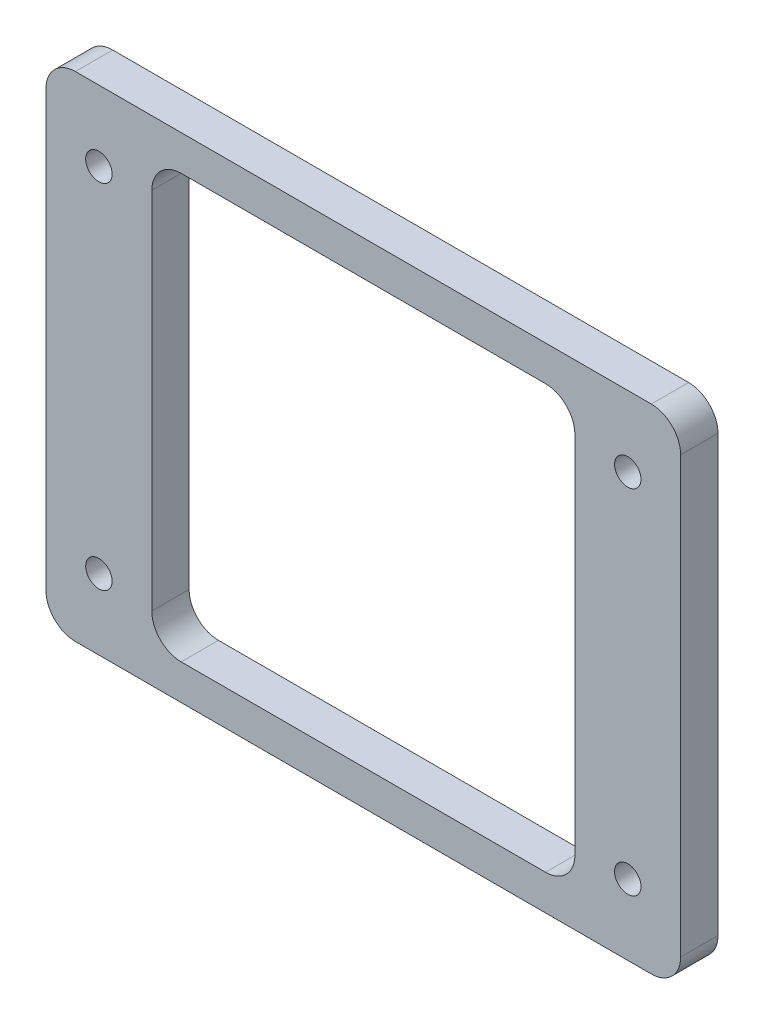
ISO-10303-21;
HEADER;
FILE_DESCRIPTION(('STEP AP214'),'2;1');
FILE_NAME('part.step','',(''),(''),'','','');
FILE_SCHEMA(('AUTOMOTIVE_DESIGN { 1 0 10303 214 1 1 1 1 }'));
ENDSEC;
DATA;
#1=APPLICATION_CONTEXT('core data for automotive mechanical design processes');
#2=APPLICATION_PROTOCOL_DEFINITION('international standard','automotive_design',2000,#1);
#3=PRODUCT_CONTEXT('',#1,'mechanical');
#4=PRODUCT('Part','Part','',(#3));
#5=PRODUCT_RELATED_PRODUCT_CATEGORY('part','',(#4));
#6=PRODUCT_DEFINITION_FORMATION('','',#4);
#7=PRODUCT_DEFINITION_CONTEXT('part definition',#1,'design');
#8=PRODUCT_DEFINITION('design','',#6,#7);
#9=PRODUCT_DEFINITION_SHAPE('','',#8);
#10=(LENGTH_UNIT() NAMED_UNIT(*) SI_UNIT(.MILLI.,.METRE.));
#11=(NAMED_UNIT(*) PLANE_ANGLE_UNIT() SI_UNIT($,.RADIAN.));
#12=(NAMED_UNIT(*) SI_UNIT($,.STERADIAN.) SOLID_ANGLE_UNIT());
#13=UNCERTAINTY_MEASURE_WITH_UNIT(LENGTH_MEASURE(1.E-05),#10,'distance_accuracy_value','');
#14=(GEOMETRIC_REPRESENTATION_CONTEXT(3) GLOBAL_UNCERTAINTY_ASSIGNED_CONTEXT((#13)) GLOBAL_UNIT_ASSIGNED_CONTEXT((#10,
#11,#12)) REPRESENTATION_CONTEXT('',''));
#15=CARTESIAN_POINT('',(0.,0.,0.));
#16=DIRECTION('',(0.,0.,1.));
#17=DIRECTION('',(1.,0.,0.));
#18=AXIS2_PLACEMENT_3D('',#15,#16,#17);
#19=CARTESIAN_POINT('',(0.,0.,6.35));
#20=DIRECTION('',(0.,0.,1.));
#21=DIRECTION('',(1.,0.,0.));
#22=AXIS2_PLACEMENT_3D('',#19,#20,#21);
#23=PLANE('',#22);
#24=CARTESIAN_POINT('',(45.1075947427528,-30.,6.35));
#25=DIRECTION('',(0.,0.,1.));
#26=DIRECTION('',(1.,0.,0.));
#27=AXIS2_PLACEMENT_3D('',#24,#25,#26);
#28=CIRCLE('',#27,2.25);
#29=CARTESIAN_POINT('',(47.3575947427528,-30.,6.35));
#30=VERTEX_POINT('',#29);
#31=EDGE_CURVE('E284',#30,#30,#28,.T.);
#32=ORIENTED_EDGE('',*,*,#31,.F.);
#33=EDGE_LOOP('',(#32));
#34=FACE_BOUND('',#33,.T.);
#35=CARTESIAN_POINT('',(-44.8924052572479,30.,6.35));
#36=DIRECTION('',(0.,0.,1.));
#37=DIRECTION('',(1.,0.,0.));
#38=AXIS2_PLACEMENT_3D('',#35,#36,#37);
#39=CIRCLE('',#38,2.25);
#40=CARTESIAN_POINT('',(-42.6424052572479,30.,6.35));
#41=VERTEX_POINT('',#40);
#42=EDGE_CURVE('E296',#41,#41,#39,.T.);
#43=ORIENTED_EDGE('',*,*,#42,.F.);
#44=EDGE_LOOP('',(#43));
#45=FACE_BOUND('',#44,.T.);
#46=DIRECTION('',(1.,0.,0.));
#47=VECTOR('',#46,1.);
#48=CARTESIAN_POINT('',(54.1075947427522,-42.,6.35));
#49=LINE('',#48,#47);
#50=CARTESIAN_POINT('',(-48.8924052572479,-42.,6.35));
#51=VERTEX_POINT('',#50);
#52=CARTESIAN_POINT('',(49.1075947427522,-42.,6.35));
#53=VERTEX_POINT('',#52);
#54=EDGE_CURVE('E303',#51,#53,#49,.T.);
#55=ORIENTED_EDGE('',*,*,#54,.T.);
#56=CARTESIAN_POINT('',(49.1075947427522,-37.,6.35));
#57=DIRECTION('',(0.,0.,1.));
#58=DIRECTION('',(1.,0.,0.));
#59=AXIS2_PLACEMENT_3D('',#56,#57,#58);
#60=CIRCLE('',#59,5.);
#61=CARTESIAN_POINT('',(54.1075947427522,-37.,6.35));
#62=VERTEX_POINT('',#61);
#63=EDGE_CURVE('E202',#53,#62,#60,.T.);
#64=ORIENTED_EDGE('',*,*,#63,.T.);
#65=DIRECTION('',(0.,1.,0.));
#66=VECTOR('',#65,1.);
#67=CARTESIAN_POINT('',(54.1075947427522,-42.,6.35));
#68=LINE('',#67,#66);
#69=CARTESIAN_POINT('',(54.1075947427522,37.,6.35));
#70=VERTEX_POINT('',#69);
#71=EDGE_CURVE('E170',#62,#70,#68,.T.);
#72=ORIENTED_EDGE('',*,*,#71,.T.);
#73=CARTESIAN_POINT('',(49.1075947427522,37.,6.35));
#74=DIRECTION('',(0.,0.,1.));
#75=DIRECTION('',(1.,0.,0.));
#76=AXIS2_PLACEMENT_3D('',#73,#74,#75);
#77=CIRCLE('',#76,5.);
#78=CARTESIAN_POINT('',(49.1075947427522,42.,6.35));
#79=VERTEX_POINT('',#78);
#80=EDGE_CURVE('E200',#70,#79,#77,.T.);
#81=ORIENTED_EDGE('',*,*,#80,.T.);
#82=DIRECTION('',(-1.,0.,0.));
#83=VECTOR('',#82,1.);
#84=CARTESIAN_POINT('',(54.1075947427522,42.,6.35));
#85=LINE('',#84,#83);
#86=CARTESIAN_POINT('',(-48.8924052572479,42.,6.35));
#87=VERTEX_POINT('',#86);
#88=EDGE_CURVE('E187',#79,#87,#85,.T.);
#89=ORIENTED_EDGE('',*,*,#88,.T.);
#90=CARTESIAN_POINT('',(-48.8924052572478,37.,6.35));
#91=DIRECTION('',(0.,0.,1.));
#92=DIRECTION('',(1.,0.,0.));
#93=AXIS2_PLACEMENT_3D('',#90,#91,#92);
#94=CIRCLE('',#93,5.);
#95=CARTESIAN_POINT('',(-53.8924052572478,37.,6.35));
#96=VERTEX_POINT('',#95);
#97=EDGE_CURVE('E196',#87,#96,#94,.T.);
#98=ORIENTED_EDGE('',*,*,#97,.T.);
#99=DIRECTION('',(0.,-1.,0.));
#100=VECTOR('',#99,1.);
#101=CARTESIAN_POINT('',(-53.8924052572478,-42.,6.35));
#102=LINE('',#101,#100);
#103=CARTESIAN_POINT('',(-53.8924052572478,-37.,6.35));
#104=VERTEX_POINT('',#103);
#105=EDGE_CURVE('E181',#96,#104,#102,.T.);
#106=ORIENTED_EDGE('',*,*,#105,.T.);
#107=CARTESIAN_POINT('',(-48.8924052572479,-37.,6.35));
#108=DIRECTION('',(0.,0.,1.));
#109=DIRECTION('',(1.,0.,0.));
#110=AXIS2_PLACEMENT_3D('',#107,#108,#109);
#111=CIRCLE('',#110,5.);
#112=EDGE_CURVE('E198',#104,#51,#111,.T.);
#113=ORIENTED_EDGE('',*,*,#112,.T.);
#114=EDGE_LOOP('',(#55,#64,#72,#81,#89,#98,#106,#113));
#115=FACE_BOUND('',#114,.T.);
#116=CARTESIAN_POINT('',(45.1075947427521,30.,6.35));
#117=DIRECTION('',(0.,0.,1.));
#118=DIRECTION('',(1.,0.,0.));
#119=AXIS2_PLACEMENT_3D('',#116,#117,#118);
#120=CIRCLE('',#119,2.25);
#121=CARTESIAN_POINT('',(47.3575947427521,30.,6.35));
#122=VERTEX_POINT('',#121);
#123=EDGE_CURVE('E290',#122,#122,#120,.T.);
#124=ORIENTED_EDGE('',*,*,#123,.F.);
#125=EDGE_LOOP('',(#124));
#126=FACE_BOUND('',#125,.T.);
#127=CARTESIAN_POINT('',(-44.8924052572472,-30.,6.35));
#128=DIRECTION('',(0.,0.,1.));
#129=DIRECTION('',(1.,0.,0.));
#130=AXIS2_PLACEMENT_3D('',#127,#128,#129);
#131=CIRCLE('',#130,2.25);
#132=CARTESIAN_POINT('',(-42.6424052572472,-30.,6.35));
#133=VERTEX_POINT('',#132);
#134=EDGE_CURVE('E278',#133,#133,#131,.T.);
#135=ORIENTED_EDGE('',*,*,#134,.F.);
#136=EDGE_LOOP('',(#135));
#137=FACE_BOUND('',#136,.T.);
#138=DIRECTION('',(1.,0.,0.));
#139=VECTOR('',#138,1.);
#140=CARTESIAN_POINT('',(36.1075947427521,-36.,6.35));
#141=LINE('',#140,#139);
#142=CARTESIAN_POINT('',(-30.8924052572478,-36.,6.35));
#143=VERTEX_POINT('',#142);
#144=CARTESIAN_POINT('',(31.1075947427521,-36.,6.35));
#145=VERTEX_POINT('',#144);
#146=EDGE_CURVE('E263',#143,#145,#141,.T.);
#147=ORIENTED_EDGE('',*,*,#146,.F.);
#148=CARTESIAN_POINT('',(-30.8924052572478,-31.,6.35));
#149=DIRECTION('',(0.,0.,1.));
#150=DIRECTION('',(1.,0.,0.));
#151=AXIS2_PLACEMENT_3D('',#148,#149,#150);
#152=CIRCLE('',#151,5.);
#153=CARTESIAN_POINT('',(-35.8924052572479,-31.,6.35));
#154=VERTEX_POINT('',#153);
#155=EDGE_CURVE('E239',#143,#154,#152,.F.);
#156=ORIENTED_EDGE('',*,*,#155,.T.);
#157=DIRECTION('',(0.,-1.,0.));
#158=VECTOR('',#157,1.);
#159=CARTESIAN_POINT('',(-35.8924052572479,-36.,6.35));
#160=LINE('',#159,#158);
#161=CARTESIAN_POINT('',(-35.8924052572479,31.,6.35));
#162=VERTEX_POINT('',#161);
#163=EDGE_CURVE('E256',#162,#154,#160,.T.);
#164=ORIENTED_EDGE('',*,*,#163,.F.);
#165=CARTESIAN_POINT('',(-30.8924052572478,31.,6.35));
#166=DIRECTION('',(0.,0.,1.));
#167=DIRECTION('',(1.,0.,0.));
#168=AXIS2_PLACEMENT_3D('',#165,#166,#167);
#169=CIRCLE('',#168,5.);
#170=CARTESIAN_POINT('',(-30.8924052572478,36.,6.35));
#171=VERTEX_POINT('',#170);
#172=EDGE_CURVE('E243',#162,#171,#169,.F.);
#173=ORIENTED_EDGE('',*,*,#172,.T.);
#174=DIRECTION('',(-1.,0.,0.));
#175=VECTOR('',#174,1.);
#176=CARTESIAN_POINT('',(36.1075947427521,36.,6.35));
#177=LINE('',#176,#175);
#178=CARTESIAN_POINT('',(31.1075947427521,36.,6.35));
#179=VERTEX_POINT('',#178);
#180=EDGE_CURVE('E262',#179,#171,#177,.T.);
#181=ORIENTED_EDGE('',*,*,#180,.F.);
#182=CARTESIAN_POINT('',(31.1075947427521,31.,6.35));
#183=DIRECTION('',(0.,0.,1.));
#184=DIRECTION('',(1.,0.,0.));
#185=AXIS2_PLACEMENT_3D('',#182,#183,#184);
#186=CIRCLE('',#185,5.);
#187=CARTESIAN_POINT('',(36.1075947427521,31.,6.35));
#188=VERTEX_POINT('',#187);
#189=EDGE_CURVE('E11',#179,#188,#186,.F.);
#190=ORIENTED_EDGE('',*,*,#189,.T.);
#191=DIRECTION('',(0.,1.,0.));
#192=VECTOR('',#191,1.);
#193=CARTESIAN_POINT('',(36.1075947427521,-36.,6.35));
#194=LINE('',#193,#192);
#195=CARTESIAN_POINT('',(36.1075947427521,-31.,6.35));
#196=VERTEX_POINT('',#195);
#197=EDGE_CURVE('E260',#196,#188,#194,.T.);
#198=ORIENTED_EDGE('',*,*,#197,.F.);
#199=CARTESIAN_POINT('',(31.1075947427521,-31.,6.35));
#200=DIRECTION('',(0.,0.,1.));
#201=DIRECTION('',(1.,0.,0.));
#202=AXIS2_PLACEMENT_3D('',#199,#200,#201);
#203=CIRCLE('',#202,5.);
#204=EDGE_CURVE('E235',#196,#145,#203,.F.);
#205=ORIENTED_EDGE('',*,*,#204,.T.);
#206=EDGE_LOOP('',(#147,#156,#164,#173,#181,#190,#198,#205));
#207=FACE_BOUND('',#206,.T.);
#208=ADVANCED_FACE('F37',(#34,#45,#115,#126,#137,#207),#23,.T.);
#209=CARTESIAN_POINT('',(0.,0.,0.));
#210=DIRECTION('',(0.,0.,1.));
#211=DIRECTION('',(1.,0.,0.));
#212=AXIS2_PLACEMENT_3D('',#209,#210,#211);
#213=PLANE('',#212);
#214=CARTESIAN_POINT('',(-44.8924052572472,-30.,0.));
#215=DIRECTION('',(0.,0.,1.));
#216=DIRECTION('',(1.,0.,0.));
#217=AXIS2_PLACEMENT_3D('',#214,#215,#216);
#218=CIRCLE('',#217,2.25);
#219=CARTESIAN_POINT('',(-42.6424052572472,-30.,0.));
#220=VERTEX_POINT('',#219);
#221=EDGE_CURVE('E265',#220,#220,#218,.T.);
#222=ORIENTED_EDGE('',*,*,#221,.T.);
#223=EDGE_LOOP('',(#222));
#224=FACE_BOUND('',#223,.T.);
#225=CARTESIAN_POINT('',(45.1075947427528,-30.,0.));
#226=DIRECTION('',(0.,0.,1.));
#227=DIRECTION('',(1.,0.,0.));
#228=AXIS2_PLACEMENT_3D('',#225,#226,#227);
#229=CIRCLE('',#228,2.25);
#230=CARTESIAN_POINT('',(47.3575947427528,-30.,0.));
#231=VERTEX_POINT('',#230);
#232=EDGE_CURVE('E281',#231,#231,#229,.T.);
#233=ORIENTED_EDGE('',*,*,#232,.T.);
#234=EDGE_LOOP('',(#233));
#235=FACE_BOUND('',#234,.T.);
#236=CARTESIAN_POINT('',(45.1075947427521,30.,0.));
#237=DIRECTION('',(0.,0.,1.));
#238=DIRECTION('',(1.,0.,0.));
#239=AXIS2_PLACEMENT_3D('',#236,#237,#238);
#240=CIRCLE('',#239,2.25);
#241=CARTESIAN_POINT('',(47.3575947427521,30.,0.));
#242=VERTEX_POINT('',#241);
#243=EDGE_CURVE('E287',#242,#242,#240,.T.);
#244=ORIENTED_EDGE('',*,*,#243,.T.);
#245=EDGE_LOOP('',(#244));
#246=FACE_BOUND('',#245,.T.);
#247=CARTESIAN_POINT('',(-44.8924052572479,30.,0.));
#248=DIRECTION('',(0.,0.,1.));
#249=DIRECTION('',(1.,0.,0.));
#250=AXIS2_PLACEMENT_3D('',#247,#248,#249);
#251=CIRCLE('',#250,2.25);
#252=CARTESIAN_POINT('',(-42.6424052572479,30.,0.));
#253=VERTEX_POINT('',#252);
#254=EDGE_CURVE('E293',#253,#253,#251,.T.);
#255=ORIENTED_EDGE('',*,*,#254,.T.);
#256=EDGE_LOOP('',(#255));
#257=FACE_BOUND('',#256,.T.);
#258=DIRECTION('',(0.,1.,0.));
#259=VECTOR('',#258,1.);
#260=CARTESIAN_POINT('',(54.1075947427522,-42.,0.));
#261=LINE('',#260,#259);
#262=CARTESIAN_POINT('',(54.1075947427522,-37.,0.));
#263=VERTEX_POINT('',#262);
#264=CARTESIAN_POINT('',(54.1075947427522,37.,0.));
#265=VERTEX_POINT('',#264);
#266=EDGE_CURVE('E167',#263,#265,#261,.T.);
#267=ORIENTED_EDGE('',*,*,#266,.F.);
#268=CARTESIAN_POINT('',(49.1075947427522,-37.,0.));
#269=DIRECTION('',(0.,0.,1.));
#270=DIRECTION('',(1.,0.,0.));
#271=AXIS2_PLACEMENT_3D('',#268,#269,#270);
#272=CIRCLE('',#271,5.);
#273=CARTESIAN_POINT('',(49.1075947427522,-42.,0.));
#274=VERTEX_POINT('',#273);
#275=EDGE_CURVE('E150',#263,#274,#272,.F.);
#276=ORIENTED_EDGE('',*,*,#275,.T.);
#277=DIRECTION('',(1.,0.,0.));
#278=VECTOR('',#277,1.);
#279=CARTESIAN_POINT('',(54.1075947427522,-42.,0.));
#280=LINE('',#279,#278);
#281=CARTESIAN_POINT('',(-48.8924052572479,-42.,0.));
#282=VERTEX_POINT('',#281);
#283=EDGE_CURVE('E178',#282,#274,#280,.T.);
#284=ORIENTED_EDGE('',*,*,#283,.F.);
#285=CARTESIAN_POINT('',(-48.8924052572479,-37.,0.));
#286=DIRECTION('',(0.,0.,1.));
#287=DIRECTION('',(1.,0.,0.));
#288=AXIS2_PLACEMENT_3D('',#285,#286,#287);
#289=CIRCLE('',#288,5.);
#290=CARTESIAN_POINT('',(-53.8924052572478,-37.,0.));
#291=VERTEX_POINT('',#290);
#292=EDGE_CURVE('E190',#282,#291,#289,.F.);
#293=ORIENTED_EDGE('',*,*,#292,.T.);
#294=DIRECTION('',(0.,-1.,0.));
#295=VECTOR('',#294,1.);
#296=CARTESIAN_POINT('',(-53.8924052572478,-42.,0.));
#297=LINE('',#296,#295);
#298=CARTESIAN_POINT('',(-53.8924052572478,37.,0.));
#299=VERTEX_POINT('',#298);
#300=EDGE_CURVE('E183',#299,#291,#297,.T.);
#301=ORIENTED_EDGE('',*,*,#300,.F.);
#302=CARTESIAN_POINT('',(-48.8924052572478,37.,0.));
#303=DIRECTION('',(0.,0.,1.));
#304=DIRECTION('',(1.,0.,0.));
#305=AXIS2_PLACEMENT_3D('',#302,#303,#304);
#306=CIRCLE('',#305,5.);
#307=CARTESIAN_POINT('',(-48.8924052572479,42.,0.));
#308=VERTEX_POINT('',#307);
#309=EDGE_CURVE('E171',#299,#308,#306,.F.);
#310=ORIENTED_EDGE('',*,*,#309,.T.);
#311=DIRECTION('',(-1.,0.,0.));
#312=VECTOR('',#311,1.);
#313=CARTESIAN_POINT('',(54.1075947427522,42.,0.));
#314=LINE('',#313,#312);
#315=CARTESIAN_POINT('',(49.1075947427522,42.,0.));
#316=VERTEX_POINT('',#315);
#317=EDGE_CURVE('E177',#316,#308,#314,.T.);
#318=ORIENTED_EDGE('',*,*,#317,.F.);
#319=CARTESIAN_POINT('',(49.1075947427522,37.,0.));
#320=DIRECTION('',(0.,0.,1.));
#321=DIRECTION('',(1.,0.,0.));
#322=AXIS2_PLACEMENT_3D('',#319,#320,#321);
#323=CIRCLE('',#322,5.);
#324=EDGE_CURVE('E161',#316,#265,#323,.F.);
#325=ORIENTED_EDGE('',*,*,#324,.T.);
#326=EDGE_LOOP('',(#267,#276,#284,#293,#301,#310,#318,#325));
#327=FACE_BOUND('',#326,.T.);
#328=DIRECTION('',(-1.,0.,0.));
#329=VECTOR('',#328,1.);
#330=CARTESIAN_POINT('',(36.1075947427521,36.,0.));
#331=LINE('',#330,#329);
#332=CARTESIAN_POINT('',(31.1075947427521,36.,0.));
#333=VERTEX_POINT('',#332);
#334=CARTESIAN_POINT('',(-30.8924052572478,36.,0.));
#335=VERTEX_POINT('',#334);
#336=EDGE_CURVE('E247',#333,#335,#331,.T.);
#337=ORIENTED_EDGE('',*,*,#336,.T.);
#338=CARTESIAN_POINT('',(-30.8924052572478,31.,0.));
#339=DIRECTION('',(0.,0.,1.));
#340=DIRECTION('',(1.,0.,0.));
#341=AXIS2_PLACEMENT_3D('',#338,#339,#340);
#342=CIRCLE('',#341,5.);
#343=CARTESIAN_POINT('',(-35.8924052572479,31.,0.));
#344=VERTEX_POINT('',#343);
#345=EDGE_CURVE('E241',#335,#344,#342,.T.);
#346=ORIENTED_EDGE('',*,*,#345,.T.);
#347=DIRECTION('',(0.,-1.,0.));
#348=VECTOR('',#347,1.);
#349=CARTESIAN_POINT('',(-35.8924052572479,-36.,0.));
#350=LINE('',#349,#348);
#351=CARTESIAN_POINT('',(-35.8924052572479,-31.,0.));
#352=VERTEX_POINT('',#351);
#353=EDGE_CURVE('E271',#344,#352,#350,.T.);
#354=ORIENTED_EDGE('',*,*,#353,.T.);
#355=CARTESIAN_POINT('',(-30.8924052572478,-31.,0.));
#356=DIRECTION('',(0.,0.,1.));
#357=DIRECTION('',(1.,0.,0.));
#358=AXIS2_PLACEMENT_3D('',#355,#356,#357);
#359=CIRCLE('',#358,5.);
#360=CARTESIAN_POINT('',(-30.8924052572478,-36.,0.));
#361=VERTEX_POINT('',#360);
#362=EDGE_CURVE('E237',#352,#361,#359,.T.);
#363=ORIENTED_EDGE('',*,*,#362,.T.);
#364=DIRECTION('',(1.,0.,0.));
#365=VECTOR('',#364,1.);
#366=CARTESIAN_POINT('',(36.1075947427521,-36.,0.));
#367=LINE('',#366,#365);
#368=CARTESIAN_POINT('',(31.1075947427521,-36.,0.));
#369=VERTEX_POINT('',#368);
#370=EDGE_CURVE('E274',#361,#369,#367,.T.);
#371=ORIENTED_EDGE('',*,*,#370,.T.);
#372=CARTESIAN_POINT('',(31.1075947427521,-31.,0.));
#373=DIRECTION('',(0.,0.,1.));
#374=DIRECTION('',(1.,0.,0.));
#375=AXIS2_PLACEMENT_3D('',#372,#373,#374);
#376=CIRCLE('',#375,5.);
#377=CARTESIAN_POINT('',(36.1075947427521,-31.,0.));
#378=VERTEX_POINT('',#377);
#379=EDGE_CURVE('E233',#369,#378,#376,.T.);
#380=ORIENTED_EDGE('',*,*,#379,.T.);
#381=DIRECTION('',(0.,1.,0.));
#382=VECTOR('',#381,1.);
#383=CARTESIAN_POINT('',(36.1075947427521,-36.,0.));
#384=LINE('',#383,#382);
#385=CARTESIAN_POINT('',(36.1075947427521,31.,0.));
#386=VERTEX_POINT('',#385);
#387=EDGE_CURVE('E248',#378,#386,#384,.T.);
#388=ORIENTED_EDGE('',*,*,#387,.T.);
#389=CARTESIAN_POINT('',(31.1075947427521,31.,0.));
#390=DIRECTION('',(0.,0.,1.));
#391=DIRECTION('',(1.,0.,0.));
#392=AXIS2_PLACEMENT_3D('',#389,#390,#391);
#393=CIRCLE('',#392,5.);
#394=EDGE_CURVE('E45',#386,#333,#393,.T.);
#395=ORIENTED_EDGE('',*,*,#394,.T.);
#396=EDGE_LOOP('',(#337,#346,#354,#363,#371,#380,#388,#395));
#397=FACE_BOUND('',#396,.T.);
#398=ADVANCED_FACE('F174',(#224,#235,#246,#257,#327,#397),#213,.F.);
#399=CARTESIAN_POINT('',(-53.8924052572478,-42.,6.35));
#400=DIRECTION('',(1.,0.,0.));
#401=DIRECTION('',(0.,0.,-1.));
#402=AXIS2_PLACEMENT_3D('',#399,#400,#401);
#403=PLANE('',#402);
#404=ORIENTED_EDGE('',*,*,#300,.T.);
#405=DIRECTION('',(0.,0.,-1.));
#406=VECTOR('',#405,1.);
#407=CARTESIAN_POINT('',(-53.8924052572478,-37.,6.35));
#408=LINE('',#407,#406);
#409=EDGE_CURVE('E231',#291,#104,#408,.F.);
#410=ORIENTED_EDGE('',*,*,#409,.T.);
#411=ORIENTED_EDGE('',*,*,#105,.F.);
#412=DIRECTION('',(0.,0.,-1.));
#413=VECTOR('',#412,1.);
#414=CARTESIAN_POINT('',(-53.8924052572478,37.,6.35));
#415=LINE('',#414,#413);
#416=EDGE_CURVE('E228',#96,#299,#415,.T.);
#417=ORIENTED_EDGE('',*,*,#416,.T.);
#418=EDGE_LOOP('',(#404,#410,#411,#417));
#419=FACE_BOUND('',#418,.T.);
#420=ADVANCED_FACE('F312',(#419),#403,.F.);
#421=CARTESIAN_POINT('',(54.1075947427522,-42.,6.35));
#422=DIRECTION('',(0.,1.,0.));
#423=DIRECTION('',(0.,0.,1.));
#424=AXIS2_PLACEMENT_3D('',#421,#422,#423);
#425=PLANE('',#424);
#426=ORIENTED_EDGE('',*,*,#283,.T.);
#427=DIRECTION('',(0.,0.,-1.));
#428=VECTOR('',#427,1.);
#429=CARTESIAN_POINT('',(49.1075947427522,-42.,6.35));
#430=LINE('',#429,#428);
#431=EDGE_CURVE('E155',#274,#53,#430,.F.);
#432=ORIENTED_EDGE('',*,*,#431,.T.);
#433=ORIENTED_EDGE('',*,*,#54,.F.);
#434=DIRECTION('',(0.,0.,-1.));
#435=VECTOR('',#434,1.);
#436=CARTESIAN_POINT('',(-48.8924052572479,-42.,6.35));
#437=LINE('',#436,#435);
#438=EDGE_CURVE('E160',#51,#282,#437,.T.);
#439=ORIENTED_EDGE('',*,*,#438,.T.);
#440=EDGE_LOOP('',(#426,#432,#433,#439));
#441=FACE_BOUND('',#440,.T.);
#442=ADVANCED_FACE('F323',(#441),#425,.F.);
#443=CARTESIAN_POINT('',(54.1075947427522,-42.,6.35));
#444=DIRECTION('',(-1.,0.,0.));
#445=DIRECTION('',(0.,0.,1.));
#446=AXIS2_PLACEMENT_3D('',#443,#444,#445);
#447=PLANE('',#446);
#448=ORIENTED_EDGE('',*,*,#71,.F.);
#449=DIRECTION('',(0.,0.,-1.));
#450=VECTOR('',#449,1.);
#451=CARTESIAN_POINT('',(54.1075947427522,-37.,6.35));
#452=LINE('',#451,#450);
#453=EDGE_CURVE('E154',#62,#263,#452,.T.);
#454=ORIENTED_EDGE('',*,*,#453,.T.);
#455=ORIENTED_EDGE('',*,*,#266,.T.);
#456=DIRECTION('',(0.,0.,-1.));
#457=VECTOR('',#456,1.);
#458=CARTESIAN_POINT('',(54.1075947427522,37.,6.35));
#459=LINE('',#458,#457);
#460=EDGE_CURVE('E172',#265,#70,#459,.F.);
#461=ORIENTED_EDGE('',*,*,#460,.T.);
#462=EDGE_LOOP('',(#448,#454,#455,#461));
#463=FACE_BOUND('',#462,.T.);
#464=ADVANCED_FACE('F166',(#463),#447,.F.);
#465=CARTESIAN_POINT('',(54.1075947427522,42.,6.35));
#466=DIRECTION('',(0.,-1.,0.));
#467=DIRECTION('',(0.,0.,-1.));
#468=AXIS2_PLACEMENT_3D('',#465,#466,#467);
#469=PLANE('',#468);
#470=ORIENTED_EDGE('',*,*,#88,.F.);
#471=DIRECTION('',(0.,0.,-1.));
#472=VECTOR('',#471,1.);
#473=CARTESIAN_POINT('',(49.1075947427522,42.,6.35));
#474=LINE('',#473,#472);
#475=EDGE_CURVE('E206',#79,#316,#474,.T.);
#476=ORIENTED_EDGE('',*,*,#475,.T.);
#477=ORIENTED_EDGE('',*,*,#317,.T.);
#478=DIRECTION('',(0.,0.,-1.));
#479=VECTOR('',#478,1.);
#480=CARTESIAN_POINT('',(-48.8924052572479,42.,6.35));
#481=LINE('',#480,#479);
#482=EDGE_CURVE('E204',#308,#87,#481,.F.);
#483=ORIENTED_EDGE('',*,*,#482,.T.);
#484=EDGE_LOOP('',(#470,#476,#477,#483));
#485=FACE_BOUND('',#484,.T.);
#486=ADVANCED_FACE('F330',(#485),#469,.F.);
#487=CARTESIAN_POINT('',(-44.8924052572479,30.,6.35));
#488=DIRECTION('',(0.,0.,-1.));
#489=DIRECTION('',(-1.,0.,0.));
#490=AXIS2_PLACEMENT_3D('',#487,#488,#489);
#491=CYLINDRICAL_SURFACE('',#490,2.25);
#492=ORIENTED_EDGE('',*,*,#42,.T.);
#493=EDGE_LOOP('',(#492));
#494=FACE_BOUND('',#493,.T.);
#495=ORIENTED_EDGE('',*,*,#254,.F.);
#496=EDGE_LOOP('',(#495));
#497=FACE_BOUND('',#496,.T.);
#498=ADVANCED_FACE('F344',(#494,#497),#491,.F.);
#499=CARTESIAN_POINT('',(45.1075947427521,30.,6.35));
#500=DIRECTION('',(0.,0.,-1.));
#501=DIRECTION('',(-1.,0.,0.));
#502=AXIS2_PLACEMENT_3D('',#499,#500,#501);
#503=CYLINDRICAL_SURFACE('',#502,2.25);
#504=ORIENTED_EDGE('',*,*,#123,.T.);
#505=EDGE_LOOP('',(#504));
#506=FACE_BOUND('',#505,.T.);
#507=ORIENTED_EDGE('',*,*,#243,.F.);
#508=EDGE_LOOP('',(#507));
#509=FACE_BOUND('',#508,.T.);
#510=ADVANCED_FACE('F352',(#506,#509),#503,.F.);
#511=CARTESIAN_POINT('',(45.1075947427528,-30.,6.35));
#512=DIRECTION('',(0.,0.,-1.));
#513=DIRECTION('',(-1.,0.,0.));
#514=AXIS2_PLACEMENT_3D('',#511,#512,#513);
#515=CYLINDRICAL_SURFACE('',#514,2.25);
#516=ORIENTED_EDGE('',*,*,#31,.T.);
#517=EDGE_LOOP('',(#516));
#518=FACE_BOUND('',#517,.T.);
#519=ORIENTED_EDGE('',*,*,#232,.F.);
#520=EDGE_LOOP('',(#519));
#521=FACE_BOUND('',#520,.T.);
#522=ADVANCED_FACE('F521',(#518,#521),#515,.F.);
#523=CARTESIAN_POINT('',(-44.8924052572472,-30.,6.35));
#524=DIRECTION('',(0.,0.,-1.));
#525=DIRECTION('',(-1.,0.,0.));
#526=AXIS2_PLACEMENT_3D('',#523,#524,#525);
#527=CYLINDRICAL_SURFACE('',#526,2.25);
#528=ORIENTED_EDGE('',*,*,#134,.T.);
#529=EDGE_LOOP('',(#528));
#530=FACE_BOUND('',#529,.T.);
#531=ORIENTED_EDGE('',*,*,#221,.F.);
#532=EDGE_LOOP('',(#531));
#533=FACE_BOUND('',#532,.T.);
#534=ADVANCED_FACE('F472',(#530,#533),#527,.F.);
#535=CARTESIAN_POINT('',(-35.8924052572479,-36.,6.35));
#536=DIRECTION('',(1.,0.,0.));
#537=DIRECTION('',(0.,0.,-1.));
#538=AXIS2_PLACEMENT_3D('',#535,#536,#537);
#539=PLANE('',#538);
#540=ORIENTED_EDGE('',*,*,#163,.T.);
#541=DIRECTION('',(0.,0.,-1.));
#542=VECTOR('',#541,1.);
#543=CARTESIAN_POINT('',(-35.8924052572479,-31.,0.));
#544=LINE('',#543,#542);
#545=EDGE_CURVE('E220',#154,#352,#544,.T.);
#546=ORIENTED_EDGE('',*,*,#545,.T.);
#547=ORIENTED_EDGE('',*,*,#353,.F.);
#548=DIRECTION('',(0.,0.,-1.));
#549=VECTOR('',#548,1.);
#550=CARTESIAN_POINT('',(-35.8924052572479,31.,6.35));
#551=LINE('',#550,#549);
#552=EDGE_CURVE('E218',#344,#162,#551,.F.);
#553=ORIENTED_EDGE('',*,*,#552,.T.);
#554=EDGE_LOOP('',(#540,#546,#547,#553));
#555=FACE_BOUND('',#554,.T.);
#556=ADVANCED_FACE('F462',(#555),#539,.T.);
#557=CARTESIAN_POINT('',(36.1075947427521,-36.,6.35));
#558=DIRECTION('',(0.,1.,0.));
#559=DIRECTION('',(-1.,0.,0.));
#560=AXIS2_PLACEMENT_3D('',#557,#558,#559);
#561=PLANE('',#560);
#562=ORIENTED_EDGE('',*,*,#146,.T.);
#563=DIRECTION('',(0.,0.,-1.));
#564=VECTOR('',#563,1.);
#565=CARTESIAN_POINT('',(31.1075947427521,-36.,0.));
#566=LINE('',#565,#564);
#567=EDGE_CURVE('E211',#145,#369,#566,.T.);
#568=ORIENTED_EDGE('',*,*,#567,.T.);
#569=ORIENTED_EDGE('',*,*,#370,.F.);
#570=DIRECTION('',(0.,0.,-1.));
#571=VECTOR('',#570,1.);
#572=CARTESIAN_POINT('',(-30.8924052572478,-36.,6.35));
#573=LINE('',#572,#571);
#574=EDGE_CURVE('E209',#361,#143,#573,.F.);
#575=ORIENTED_EDGE('',*,*,#574,.T.);
#576=EDGE_LOOP('',(#562,#568,#569,#575));
#577=FACE_BOUND('',#576,.T.);
#578=ADVANCED_FACE('F452',(#577),#561,.T.);
#579=CARTESIAN_POINT('',(36.1075947427521,-36.,6.35));
#580=DIRECTION('',(-1.,0.,0.));
#581=DIRECTION('',(0.,0.,1.));
#582=AXIS2_PLACEMENT_3D('',#579,#580,#581);
#583=PLANE('',#582);
#584=ORIENTED_EDGE('',*,*,#387,.F.);
#585=DIRECTION('',(0.,0.,-1.));
#586=VECTOR('',#585,1.);
#587=CARTESIAN_POINT('',(36.1075947427521,-31.,6.35));
#588=LINE('',#587,#586);
#589=EDGE_CURVE('E57',#378,#196,#588,.F.);
#590=ORIENTED_EDGE('',*,*,#589,.T.);
#591=ORIENTED_EDGE('',*,*,#197,.T.);
#592=DIRECTION('',(0.,0.,-1.));
#593=VECTOR('',#592,1.);
#594=CARTESIAN_POINT('',(36.1075947427521,31.,0.));
#595=LINE('',#594,#593);
#596=EDGE_CURVE('E214',#188,#386,#595,.T.);
#597=ORIENTED_EDGE('',*,*,#596,.T.);
#598=EDGE_LOOP('',(#584,#590,#591,#597));
#599=FACE_BOUND('',#598,.T.);
#600=ADVANCED_FACE('F259',(#599),#583,.T.);
#601=CARTESIAN_POINT('',(36.1075947427521,36.,6.35));
#602=DIRECTION('',(0.,-1.,0.));
#603=DIRECTION('',(1.,0.,0.));
#604=AXIS2_PLACEMENT_3D('',#601,#602,#603);
#605=PLANE('',#604);
#606=ORIENTED_EDGE('',*,*,#180,.T.);
#607=DIRECTION('',(0.,0.,-1.));
#608=VECTOR('',#607,1.);
#609=CARTESIAN_POINT('',(-30.8924052572478,36.,0.));
#610=LINE('',#609,#608);
#611=EDGE_CURVE('E225',#171,#335,#610,.T.);
#612=ORIENTED_EDGE('',*,*,#611,.T.);
#613=ORIENTED_EDGE('',*,*,#336,.F.);
#614=DIRECTION('',(0.,0.,-1.));
#615=VECTOR('',#614,1.);
#616=CARTESIAN_POINT('',(31.1075947427521,36.,6.35));
#617=LINE('',#616,#615);
#618=EDGE_CURVE('E223',#333,#179,#617,.F.);
#619=ORIENTED_EDGE('',*,*,#618,.T.);
#620=EDGE_LOOP('',(#606,#612,#613,#619));
#621=FACE_BOUND('',#620,.T.);
#622=ADVANCED_FACE('F254',(#621),#605,.T.);
#623=CARTESIAN_POINT('',(49.1075947427522,-37.,6.35));
#624=DIRECTION('',(0.,0.,-1.));
#625=DIRECTION('',(-1.,0.,0.));
#626=AXIS2_PLACEMENT_3D('',#623,#624,#625);
#627=CYLINDRICAL_SURFACE('',#626,5.);
#628=ORIENTED_EDGE('',*,*,#63,.F.);
#629=ORIENTED_EDGE('',*,*,#431,.F.);
#630=ORIENTED_EDGE('',*,*,#275,.F.);
#631=ORIENTED_EDGE('',*,*,#453,.F.);
#632=EDGE_LOOP('',(#628,#629,#630,#631));
#633=FACE_BOUND('',#632,.T.);
#634=ADVANCED_FACE('F153',(#633),#627,.T.);
#635=CARTESIAN_POINT('',(49.1075947427522,37.,6.35));
#636=DIRECTION('',(0.,0.,-1.));
#637=DIRECTION('',(-1.,0.,0.));
#638=AXIS2_PLACEMENT_3D('',#635,#636,#637);
#639=CYLINDRICAL_SURFACE('',#638,5.);
#640=ORIENTED_EDGE('',*,*,#80,.F.);
#641=ORIENTED_EDGE('',*,*,#460,.F.);
#642=ORIENTED_EDGE('',*,*,#324,.F.);
#643=ORIENTED_EDGE('',*,*,#475,.F.);
#644=EDGE_LOOP('',(#640,#641,#642,#643));
#645=FACE_BOUND('',#644,.T.);
#646=ADVANCED_FACE('F360',(#645),#639,.T.);
#647=CARTESIAN_POINT('',(31.1075947427521,-31.,6.35));
#648=DIRECTION('',(0.,0.,1.));
#649=DIRECTION('',(1.,0.,0.));
#650=AXIS2_PLACEMENT_3D('',#647,#648,#649);
#651=CYLINDRICAL_SURFACE('',#650,5.);
#652=ORIENTED_EDGE('',*,*,#204,.F.);
#653=ORIENTED_EDGE('',*,*,#589,.F.);
#654=ORIENTED_EDGE('',*,*,#379,.F.);
#655=ORIENTED_EDGE('',*,*,#567,.F.);
#656=EDGE_LOOP('',(#652,#653,#654,#655));
#657=FACE_BOUND('',#656,.T.);
#658=ADVANCED_FACE('F362',(#657),#651,.F.);
#659=CARTESIAN_POINT('',(-30.8924052572478,-31.,6.35));
#660=DIRECTION('',(0.,0.,1.));
#661=DIRECTION('',(1.,0.,0.));
#662=AXIS2_PLACEMENT_3D('',#659,#660,#661);
#663=CYLINDRICAL_SURFACE('',#662,5.);
#664=ORIENTED_EDGE('',*,*,#155,.F.);
#665=ORIENTED_EDGE('',*,*,#574,.F.);
#666=ORIENTED_EDGE('',*,*,#362,.F.);
#667=ORIENTED_EDGE('',*,*,#545,.F.);
#668=EDGE_LOOP('',(#664,#665,#666,#667));
#669=FACE_BOUND('',#668,.T.);
#670=ADVANCED_FACE('F368',(#669),#663,.F.);
#671=CARTESIAN_POINT('',(-30.8924052572478,31.,6.35));
#672=DIRECTION('',(0.,0.,1.));
#673=DIRECTION('',(1.,0.,0.));
#674=AXIS2_PLACEMENT_3D('',#671,#672,#673);
#675=CYLINDRICAL_SURFACE('',#674,5.);
#676=ORIENTED_EDGE('',*,*,#172,.F.);
#677=ORIENTED_EDGE('',*,*,#552,.F.);
#678=ORIENTED_EDGE('',*,*,#345,.F.);
#679=ORIENTED_EDGE('',*,*,#611,.F.);
#680=EDGE_LOOP('',(#676,#677,#678,#679));
#681=FACE_BOUND('',#680,.T.);
#682=ADVANCED_FACE('F375',(#681),#675,.F.);
#683=CARTESIAN_POINT('',(31.1075947427521,31.,6.35));
#684=DIRECTION('',(0.,0.,1.));
#685=DIRECTION('',(1.,0.,0.));
#686=AXIS2_PLACEMENT_3D('',#683,#684,#685);
#687=CYLINDRICAL_SURFACE('',#686,5.);
#688=ORIENTED_EDGE('',*,*,#189,.F.);
#689=ORIENTED_EDGE('',*,*,#618,.F.);
#690=ORIENTED_EDGE('',*,*,#394,.F.);
#691=ORIENTED_EDGE('',*,*,#596,.F.);
#692=EDGE_LOOP('',(#688,#689,#690,#691));
#693=FACE_BOUND('',#692,.T.);
#694=ADVANCED_FACE('F258',(#693),#687,.F.);
#695=CARTESIAN_POINT('',(-48.8924052572479,-37.,6.35));
#696=DIRECTION('',(0.,0.,-1.));
#697=DIRECTION('',(-1.,0.,0.));
#698=AXIS2_PLACEMENT_3D('',#695,#696,#697);
#699=CYLINDRICAL_SURFACE('',#698,5.);
#700=ORIENTED_EDGE('',*,*,#112,.F.);
#701=ORIENTED_EDGE('',*,*,#409,.F.);
#702=ORIENTED_EDGE('',*,*,#292,.F.);
#703=ORIENTED_EDGE('',*,*,#438,.F.);
#704=EDGE_LOOP('',(#700,#701,#702,#703));
#705=FACE_BOUND('',#704,.T.);
#706=ADVANCED_FACE('F317',(#705),#699,.T.);
#707=CARTESIAN_POINT('',(-48.8924052572478,37.,6.35));
#708=DIRECTION('',(0.,0.,-1.));
#709=DIRECTION('',(-1.,0.,0.));
#710=AXIS2_PLACEMENT_3D('',#707,#708,#709);
#711=CYLINDRICAL_SURFACE('',#710,5.);
#712=ORIENTED_EDGE('',*,*,#97,.F.);
#713=ORIENTED_EDGE('',*,*,#482,.F.);
#714=ORIENTED_EDGE('',*,*,#309,.F.);
#715=ORIENTED_EDGE('',*,*,#416,.F.);
#716=EDGE_LOOP('',(#712,#713,#714,#715));
#717=FACE_BOUND('',#716,.T.);
#718=ADVANCED_FACE('F39',(#717),#711,.T.);
#719=CLOSED_SHELL('',(#208,#398,#420,#442,#464,#486,#498,#510,#522,#534,#556,#578,#600,#622,
#634,#646,#658,#670,#682,#694,#706,#718));
#720=MANIFOLD_SOLID_BREP('B2',#719);
#721=ADVANCED_BREP_SHAPE_REPRESENTATION('',(#18,#720),#14);
#722=SHAPE_DEFINITION_REPRESENTATION(#9,#721);
ENDSEC;
END-ISO-10303-21;
